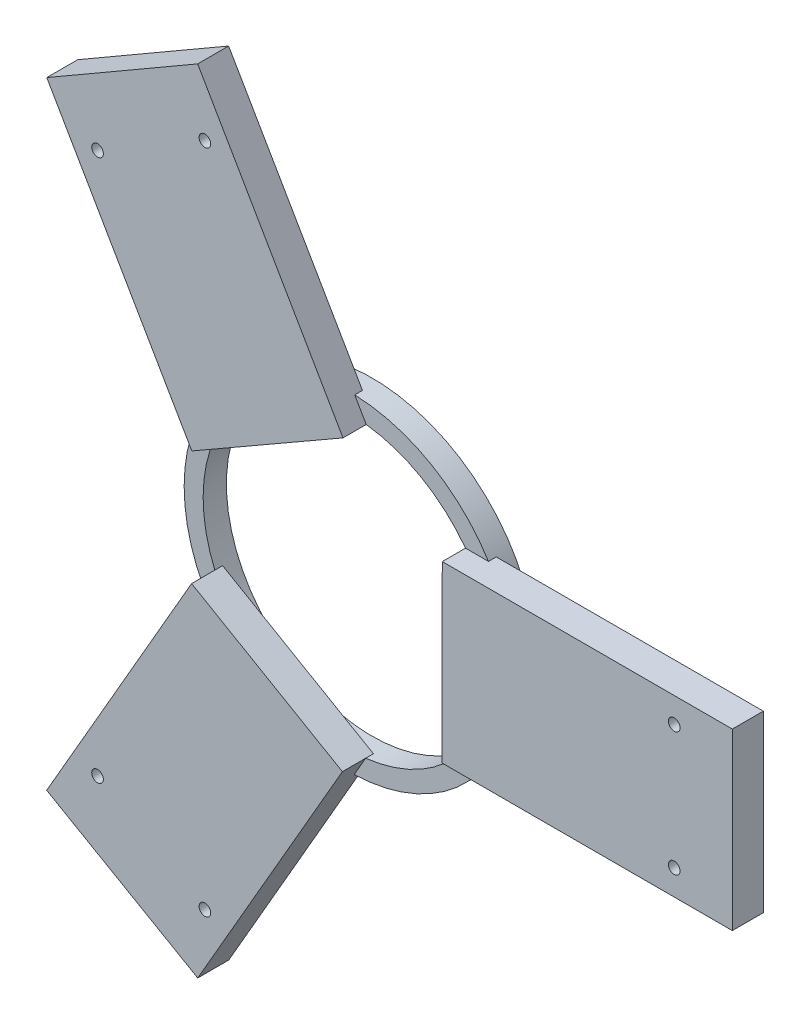
ISO-10303-21;
HEADER;
FILE_DESCRIPTION(('STEP AP214'),'2;1');
FILE_NAME('part.step','',(''),(''),'','','');
FILE_SCHEMA(('AUTOMOTIVE_DESIGN { 1 0 10303 214 1 1 1 1 }'));
ENDSEC;
DATA;
#1=APPLICATION_CONTEXT('core data for automotive mechanical design processes');
#2=APPLICATION_PROTOCOL_DEFINITION('international standard','automotive_design',2000,#1);
#3=PRODUCT_CONTEXT('',#1,'mechanical');
#4=PRODUCT('Part','Part','',(#3));
#5=PRODUCT_RELATED_PRODUCT_CATEGORY('part','',(#4));
#6=PRODUCT_DEFINITION_FORMATION('','',#4);
#7=PRODUCT_DEFINITION_CONTEXT('part definition',#1,'design');
#8=PRODUCT_DEFINITION('design','',#6,#7);
#9=PRODUCT_DEFINITION_SHAPE('','',#8);
#10=(LENGTH_UNIT() NAMED_UNIT(*) SI_UNIT(.MILLI.,.METRE.));
#11=(NAMED_UNIT(*) PLANE_ANGLE_UNIT() SI_UNIT($,.RADIAN.));
#12=(NAMED_UNIT(*) SI_UNIT($,.STERADIAN.) SOLID_ANGLE_UNIT());
#13=UNCERTAINTY_MEASURE_WITH_UNIT(LENGTH_MEASURE(1.E-05),#10,'distance_accuracy_value','');
#14=(GEOMETRIC_REPRESENTATION_CONTEXT(3) GLOBAL_UNCERTAINTY_ASSIGNED_CONTEXT((#13)) GLOBAL_UNIT_ASSIGNED_CONTEXT((#10,
#11,#12)) REPRESENTATION_CONTEXT('',''));
#15=CARTESIAN_POINT('',(0.,0.,0.));
#16=DIRECTION('',(0.,0.,1.));
#17=DIRECTION('',(1.,0.,0.));
#18=AXIS2_PLACEMENT_3D('',#15,#16,#17);
#19=CARTESIAN_POINT('',(300.,300.,12.));
#20=DIRECTION('',(0.,0.,-1.));
#21=DIRECTION('',(-1.,0.,0.));
#22=AXIS2_PLACEMENT_3D('',#19,#20,#21);
#23=CYLINDRICAL_SURFACE('',#22,85.);
#24=CARTESIAN_POINT('',(300.,300.,0.));
#25=DIRECTION('',(0.,0.,1.));
#26=DIRECTION('',(1.,0.,0.));
#27=AXIS2_PLACEMENT_3D('',#24,#25,#26);
#28=CIRCLE('',#27,85.);
#29=CARTESIAN_POINT('',(385.,300.,0.));
#30=VERTEX_POINT('',#29);
#31=EDGE_CURVE('E342',#30,#30,#28,.T.);
#32=ORIENTED_EDGE('',*,*,#31,.T.);
#33=EDGE_LOOP('',(#32));
#34=FACE_BOUND('',#33,.T.);
#35=DIRECTION('',(0.,0.,-1.));
#36=VECTOR('',#35,1.);
#37=CARTESIAN_POINT('',(224.91219391643,260.165073395874,12.));
#38=LINE('',#37,#36);
#39=CARTESIAN_POINT('',(224.91219391643,260.165073395874,12.));
#40=VERTEX_POINT('',#39);
#41=CARTESIAN_POINT('',(224.91219391643,260.165073395874,8.));
#42=VERTEX_POINT('',#41);
#43=EDGE_CURVE('E214',#40,#42,#38,.T.);
#44=ORIENTED_EDGE('',*,*,#43,.F.);
#45=CARTESIAN_POINT('',(300.,300.,12.));
#46=DIRECTION('',(0.,0.,1.));
#47=DIRECTION('',(1.,0.,0.));
#48=AXIS2_PLACEMENT_3D('',#45,#46,#47);
#49=CIRCLE('',#48,85.);
#50=CARTESIAN_POINT('',(225.034550566013,340.064715039051,12.));
#51=VERTEX_POINT('',#50);
#52=EDGE_CURVE('E339',#51,#40,#49,.T.);
#53=ORIENTED_EDGE('',*,*,#52,.F.);
#54=DIRECTION('',(0.,0.,-1.));
#55=VECTOR('',#54,1.);
#56=CARTESIAN_POINT('',(225.034550566013,340.064715039051,12.));
#57=LINE('',#56,#55);
#58=CARTESIAN_POINT('',(225.034550566013,340.064715039051,8.));
#59=VERTEX_POINT('',#58);
#60=EDGE_CURVE('E264',#59,#51,#57,.F.);
#61=ORIENTED_EDGE('',*,*,#60,.F.);
#62=CARTESIAN_POINT('',(300.,300.,8.));
#63=DIRECTION('',(0.,0.,1.));
#64=DIRECTION('',(1.,0.,0.));
#65=AXIS2_PLACEMENT_3D('',#62,#63,#64);
#66=CIRCLE('',#65,85.);
#67=CARTESIAN_POINT('',(303.045844644723,384.945410884875,8.));
#68=VERTEX_POINT('',#67);
#69=EDGE_CURVE('E257',#68,#59,#66,.T.);
#70=ORIENTED_EDGE('',*,*,#69,.F.);
#71=DIRECTION('',(0.,0.,-1.));
#72=VECTOR('',#71,1.);
#73=CARTESIAN_POINT('',(303.045844644723,384.945410884875,12.));
#74=LINE('',#73,#72);
#75=CARTESIAN_POINT('',(303.045844644723,384.945410884875,12.));
#76=VERTEX_POINT('',#75);
#77=EDGE_CURVE('E269',#76,#68,#74,.T.);
#78=ORIENTED_EDGE('',*,*,#77,.F.);
#79=CARTESIAN_POINT('',(372.11102550928,345.,12.));
#80=VERTEX_POINT('',#79);
#81=EDGE_CURVE('E336',#80,#76,#49,.T.);
#82=ORIENTED_EDGE('',*,*,#81,.F.);
#83=DIRECTION('',(0.,0.,-1.));
#84=VECTOR('',#83,1.);
#85=CARTESIAN_POINT('',(372.11102550928,345.,12.));
#86=LINE('',#85,#84);
#87=CARTESIAN_POINT('',(372.11102550928,345.,8.));
#88=VERTEX_POINT('',#87);
#89=EDGE_CURVE('E321',#88,#80,#86,.F.);
#90=ORIENTED_EDGE('',*,*,#89,.F.);
#91=CARTESIAN_POINT('',(300.,300.,8.));
#92=DIRECTION('',(0.,0.,1.));
#93=DIRECTION('',(1.,0.,0.));
#94=AXIS2_PLACEMENT_3D('',#91,#92,#93);
#95=CIRCLE('',#94,85.);
#96=CARTESIAN_POINT('',(372.036002110056,254.88,8.));
#97=VERTEX_POINT('',#96);
#98=EDGE_CURVE('E316',#97,#88,#95,.T.);
#99=ORIENTED_EDGE('',*,*,#98,.F.);
#100=DIRECTION('',(0.,0.,-1.));
#101=VECTOR('',#100,1.);
#102=CARTESIAN_POINT('',(372.036002110056,254.88,12.));
#103=LINE('',#102,#101);
#104=CARTESIAN_POINT('',(372.036002110056,254.88,12.));
#105=VERTEX_POINT('',#104);
#106=EDGE_CURVE('E330',#105,#97,#103,.T.);
#107=ORIENTED_EDGE('',*,*,#106,.F.);
#108=CARTESIAN_POINT('',(302.785663697791,215.045658864524,12.));
#109=VERTEX_POINT('',#108);
#110=EDGE_CURVE('E341',#109,#105,#49,.T.);
#111=ORIENTED_EDGE('',*,*,#110,.F.);
#112=DIRECTION('',(0.,0.,-1.));
#113=VECTOR('',#112,1.);
#114=CARTESIAN_POINT('',(302.785663697791,215.045658864524,12.));
#115=LINE('',#114,#113);
#116=CARTESIAN_POINT('',(302.785663697791,215.045658864524,8.));
#117=VERTEX_POINT('',#116);
#118=EDGE_CURVE('E52',#117,#109,#115,.F.);
#119=ORIENTED_EDGE('',*,*,#118,.F.);
#120=CARTESIAN_POINT('',(300.,300.,8.));
#121=DIRECTION('',(0.,0.,1.));
#122=DIRECTION('',(1.,0.,0.));
#123=AXIS2_PLACEMENT_3D('',#120,#121,#122);
#124=CIRCLE('',#123,85.);
#125=EDGE_CURVE('E60',#42,#117,#124,.T.);
#126=ORIENTED_EDGE('',*,*,#125,.F.);
#127=EDGE_LOOP('',(#44,#53,#61,#70,#78,#82,#90,#99,#107,#111,#119,#126));
#128=FACE_BOUND('',#127,.T.);
#129=ADVANCED_FACE('F39',(#34,#128),#23,.T.);
#130=CARTESIAN_POINT('',(300.,300.,12.));
#131=DIRECTION('',(0.,0.,1.));
#132=DIRECTION('',(1.,0.,0.));
#133=AXIS2_PLACEMENT_3D('',#130,#131,#132);
#134=PLANE('',#133);
#135=ORIENTED_EDGE('',*,*,#52,.T.);
#136=DIRECTION('',(0.499306279760121,0.866425553058142,0.));
#137=VECTOR('',#136,1.);
#138=CARTESIAN_POINT('',(260.865147740129,322.552748383134,12.));
#139=LINE('',#138,#137);
#140=CARTESIAN_POINT('',(230.844933781246,270.459911708328,12.));
#141=VERTEX_POINT('',#140);
#142=EDGE_CURVE('E213',#40,#141,#139,.T.);
#143=ORIENTED_EDGE('',*,*,#142,.T.);
#144=CARTESIAN_POINT('',(300.,300.,12.));
#145=DIRECTION('',(0.,0.,1.));
#146=DIRECTION('',(1.,0.,0.));
#147=AXIS2_PLACEMENT_3D('',#144,#145,#146);
#148=CIRCLE('',#147,75.2);
#149=CARTESIAN_POINT('',(230.963081874477,329.815162849293,12.));
#150=VERTEX_POINT('',#149);
#151=EDGE_CURVE('E333',#150,#141,#148,.T.);
#152=ORIENTED_EDGE('',*,*,#151,.F.);
#153=DIRECTION('',(-0.500693399556272,0.865624699070436,0.));
#154=VECTOR('',#153,1.);
#155=CARTESIAN_POINT('',(261.192481221797,277.553010529542,12.));
#156=LINE('',#155,#154);
#157=EDGE_CURVE('E263',#150,#51,#156,.T.);
#158=ORIENTED_EDGE('',*,*,#157,.T.);
#159=EDGE_LOOP('',(#135,#143,#152,#158));
#160=FACE_BOUND('',#159,.T.);
#161=ADVANCED_FACE('F435',(#160),#134,.T.);
#162=CARTESIAN_POINT('',(308.697770617303,225.304693679664,12.));
#163=VERTEX_POINT('',#162);
#164=CARTESIAN_POINT('',(360.16,254.88,12.));
#165=VERTEX_POINT('',#164);
#166=EDGE_CURVE('E329',#163,#165,#148,.T.);
#167=ORIENTED_EDGE('',*,*,#166,.F.);
#168=DIRECTION('',(-0.499306279760121,-0.866425553058142,0.));
#169=VECTOR('',#168,1.);
#170=CARTESIAN_POINT('',(338.843422508999,277.615197615464,12.));
#171=LINE('',#170,#169);
#172=EDGE_CURVE('E202',#163,#109,#171,.T.);
#173=ORIENTED_EDGE('',*,*,#172,.T.);
#174=ORIENTED_EDGE('',*,*,#110,.T.);
#175=DIRECTION('',(-1.,0.,0.));
#176=VECTOR('',#175,1.);
#177=CARTESIAN_POINT('',(300.,254.88,12.));
#178=LINE('',#177,#176);
#179=EDGE_CURVE('E322',#105,#165,#178,.T.);
#180=ORIENTED_EDGE('',*,*,#179,.T.);
#181=EDGE_LOOP('',(#167,#173,#174,#180));
#182=FACE_BOUND('',#181,.T.);
#183=ADVANCED_FACE('F437',(#182),#134,.T.);
#184=CARTESIAN_POINT('',(300.,300.,-20.));
#185=DIRECTION('',(0.,0.,1.));
#186=DIRECTION('',(1.,0.,0.));
#187=AXIS2_PLACEMENT_3D('',#184,#185,#186);
#188=CYLINDRICAL_SURFACE('',#187,75.2);
#189=CARTESIAN_POINT('',(300.,300.,0.));
#190=DIRECTION('',(0.,0.,1.));
#191=DIRECTION('',(1.,0.,0.));
#192=AXIS2_PLACEMENT_3D('',#189,#190,#191);
#193=CIRCLE('',#192,75.2);
#194=CARTESIAN_POINT('',(375.2,300.,0.));
#195=VERTEX_POINT('',#194);
#196=EDGE_CURVE('E331',#195,#195,#193,.T.);
#197=ORIENTED_EDGE('',*,*,#196,.F.);
#198=EDGE_LOOP('',(#197));
#199=FACE_BOUND('',#198,.T.);
#200=DIRECTION('',(0.,0.,1.));
#201=VECTOR('',#200,1.);
#202=CARTESIAN_POINT('',(230.844933781246,270.459911708328,-20.));
#203=LINE('',#202,#201);
#204=CARTESIAN_POINT('',(230.844933781246,270.459911708328,8.));
#205=VERTEX_POINT('',#204);
#206=EDGE_CURVE('E11',#205,#141,#203,.T.);
#207=ORIENTED_EDGE('',*,*,#206,.F.);
#208=CARTESIAN_POINT('',(300.,300.,8.));
#209=DIRECTION('',(0.,0.,1.));
#210=DIRECTION('',(1.,0.,0.));
#211=AXIS2_PLACEMENT_3D('',#208,#209,#210);
#212=CIRCLE('',#211,75.2);
#213=CARTESIAN_POINT('',(308.697770617303,225.304693679664,8.));
#214=VERTEX_POINT('',#213);
#215=EDGE_CURVE('E365',#214,#205,#212,.F.);
#216=ORIENTED_EDGE('',*,*,#215,.F.);
#217=DIRECTION('',(0.,0.,1.));
#218=VECTOR('',#217,1.);
#219=CARTESIAN_POINT('',(308.697770617303,225.304693679664,-20.));
#220=LINE('',#219,#218);
#221=EDGE_CURVE('E46',#163,#214,#220,.F.);
#222=ORIENTED_EDGE('',*,*,#221,.F.);
#223=ORIENTED_EDGE('',*,*,#166,.T.);
#224=DIRECTION('',(0.,0.,1.));
#225=VECTOR('',#224,1.);
#226=CARTESIAN_POINT('',(360.16,254.88,-20.));
#227=LINE('',#226,#225);
#228=CARTESIAN_POINT('',(360.16,254.88,8.));
#229=VERTEX_POINT('',#228);
#230=EDGE_CURVE('E355',#229,#165,#227,.T.);
#231=ORIENTED_EDGE('',*,*,#230,.F.);
#232=CARTESIAN_POINT('',(300.,300.,8.));
#233=DIRECTION('',(0.,0.,1.));
#234=DIRECTION('',(1.,0.,0.));
#235=AXIS2_PLACEMENT_3D('',#232,#233,#234);
#236=CIRCLE('',#235,75.2);
#237=CARTESIAN_POINT('',(360.249813277719,345.,8.));
#238=VERTEX_POINT('',#237);
#239=EDGE_CURVE('E338',#238,#229,#236,.F.);
#240=ORIENTED_EDGE('',*,*,#239,.F.);
#241=DIRECTION('',(0.,0.,1.));
#242=VECTOR('',#241,1.);
#243=CARTESIAN_POINT('',(360.249813277719,345.,-20.));
#244=LINE('',#243,#242);
#245=CARTESIAN_POINT('',(360.249813277719,345.,12.));
#246=VERTEX_POINT('',#245);
#247=EDGE_CURVE('E349',#246,#238,#244,.F.);
#248=ORIENTED_EDGE('',*,*,#247,.F.);
#249=CARTESIAN_POINT('',(308.995066218754,374.660088291672,12.));
#250=VERTEX_POINT('',#249);
#251=EDGE_CURVE('E332',#246,#250,#148,.T.);
#252=ORIENTED_EDGE('',*,*,#251,.T.);
#253=DIRECTION('',(0.,0.,1.));
#254=VECTOR('',#253,1.);
#255=CARTESIAN_POINT('',(308.995066218754,374.660088291672,-20.));
#256=LINE('',#255,#254);
#257=CARTESIAN_POINT('',(308.995066218754,374.660088291672,8.));
#258=VERTEX_POINT('',#257);
#259=EDGE_CURVE('E363',#258,#250,#256,.T.);
#260=ORIENTED_EDGE('',*,*,#259,.F.);
#261=CARTESIAN_POINT('',(300.,300.,8.));
#262=DIRECTION('',(0.,0.,1.));
#263=DIRECTION('',(1.,0.,0.));
#264=AXIS2_PLACEMENT_3D('',#261,#262,#263);
#265=CIRCLE('',#264,75.2);
#266=CARTESIAN_POINT('',(230.963081874477,329.815162849293,8.));
#267=VERTEX_POINT('',#266);
#268=EDGE_CURVE('E354',#267,#258,#265,.F.);
#269=ORIENTED_EDGE('',*,*,#268,.F.);
#270=DIRECTION('',(0.,0.,1.));
#271=VECTOR('',#270,1.);
#272=CARTESIAN_POINT('',(230.963081874477,329.815162849293,-20.));
#273=LINE('',#272,#271);
#274=EDGE_CURVE('E359',#150,#267,#273,.F.);
#275=ORIENTED_EDGE('',*,*,#274,.F.);
#276=ORIENTED_EDGE('',*,*,#151,.T.);
#277=EDGE_LOOP('',(#207,#216,#222,#223,#231,#240,#248,#252,#260,#269,#275,#276));
#278=FACE_BOUND('',#277,.T.);
#279=ADVANCED_FACE('F461',(#199,#278),#188,.F.);
#280=ORIENTED_EDGE('',*,*,#81,.T.);
#281=DIRECTION('',(0.500693399556272,-0.865624699070436,0.));
#282=VECTOR('',#281,1.);
#283=CARTESIAN_POINT('',(339.098679154888,322.615402038832,12.));
#284=LINE('',#283,#282);
#285=EDGE_CURVE('E268',#76,#250,#284,.T.);
#286=ORIENTED_EDGE('',*,*,#285,.T.);
#287=ORIENTED_EDGE('',*,*,#251,.F.);
#288=DIRECTION('',(1.,0.,0.));
#289=VECTOR('',#288,1.);
#290=CARTESIAN_POINT('',(300.,345.,12.));
#291=LINE('',#290,#289);
#292=EDGE_CURVE('E317',#246,#80,#291,.T.);
#293=ORIENTED_EDGE('',*,*,#292,.T.);
#294=EDGE_LOOP('',(#280,#286,#287,#293));
#295=FACE_BOUND('',#294,.T.);
#296=ADVANCED_FACE('F442',(#295),#134,.T.);
#297=CARTESIAN_POINT('',(300.,300.,0.));
#298=DIRECTION('',(0.,0.,1.));
#299=DIRECTION('',(1.,0.,0.));
#300=AXIS2_PLACEMENT_3D('',#297,#298,#299);
#301=PLANE('',#300);
#302=ORIENTED_EDGE('',*,*,#196,.T.);
#303=EDGE_LOOP('',(#302));
#304=FACE_BOUND('',#303,.T.);
#305=ORIENTED_EDGE('',*,*,#31,.F.);
#306=EDGE_LOOP('',(#305));
#307=FACE_BOUND('',#306,.T.);
#308=ADVANCED_FACE('F486',(#304,#307),#301,.F.);
#309=CARTESIAN_POINT('',(360.16,254.88,24.));
#310=DIRECTION('',(0.,1.,0.));
#311=DIRECTION('',(0.,0.,1.));
#312=AXIS2_PLACEMENT_3D('',#309,#310,#311);
#313=PLANE('',#312);
#314=ORIENTED_EDGE('',*,*,#179,.F.);
#315=ORIENTED_EDGE('',*,*,#106,.T.);
#316=DIRECTION('',(1.,0.,0.));
#317=VECTOR('',#316,1.);
#318=CARTESIAN_POINT('',(360.16,254.88,8.));
#319=LINE('',#318,#317);
#320=CARTESIAN_POINT('',(510.,254.88,8.));
#321=VERTEX_POINT('',#320);
#322=EDGE_CURVE('E298',#97,#321,#319,.T.);
#323=ORIENTED_EDGE('',*,*,#322,.T.);
#324=DIRECTION('',(0.,0.,-1.));
#325=VECTOR('',#324,1.);
#326=CARTESIAN_POINT('',(510.,254.88,24.));
#327=LINE('',#326,#325);
#328=CARTESIAN_POINT('',(510.,254.88,24.));
#329=VERTEX_POINT('',#328);
#330=EDGE_CURVE('E309',#329,#321,#327,.T.);
#331=ORIENTED_EDGE('',*,*,#330,.F.);
#332=DIRECTION('',(1.,0.,0.));
#333=VECTOR('',#332,1.);
#334=CARTESIAN_POINT('',(360.16,254.88,24.));
#335=LINE('',#334,#333);
#336=CARTESIAN_POINT('',(360.16,254.88,24.));
#337=VERTEX_POINT('',#336);
#338=EDGE_CURVE('E288',#337,#329,#335,.T.);
#339=ORIENTED_EDGE('',*,*,#338,.F.);
#340=DIRECTION('',(0.,0.,-1.));
#341=VECTOR('',#340,1.);
#342=CARTESIAN_POINT('',(360.16,254.88,24.));
#343=LINE('',#342,#341);
#344=EDGE_CURVE('E311',#337,#165,#343,.T.);
#345=ORIENTED_EDGE('',*,*,#344,.T.);
#346=EDGE_LOOP('',(#314,#315,#323,#331,#339,#345));
#347=FACE_BOUND('',#346,.T.);
#348=ADVANCED_FACE('F453',(#347),#313,.F.);
#349=CARTESIAN_POINT('',(510.,345.,24.));
#350=DIRECTION('',(0.,-1.,0.));
#351=DIRECTION('',(0.,0.,-1.));
#352=AXIS2_PLACEMENT_3D('',#349,#350,#351);
#353=PLANE('',#352);
#354=DIRECTION('',(-1.,0.,0.));
#355=VECTOR('',#354,1.);
#356=CARTESIAN_POINT('',(510.,345.,8.));
#357=LINE('',#356,#355);
#358=CARTESIAN_POINT('',(510.,345.,8.));
#359=VERTEX_POINT('',#358);
#360=EDGE_CURVE('E290',#359,#88,#357,.T.);
#361=ORIENTED_EDGE('',*,*,#360,.T.);
#362=ORIENTED_EDGE('',*,*,#89,.T.);
#363=ORIENTED_EDGE('',*,*,#292,.F.);
#364=DIRECTION('',(0.,0.,-1.));
#365=VECTOR('',#364,1.);
#366=CARTESIAN_POINT('',(360.249813277719,345.,24.));
#367=LINE('',#366,#365);
#368=CARTESIAN_POINT('',(360.249813277719,345.,24.));
#369=VERTEX_POINT('',#368);
#370=EDGE_CURVE('E296',#369,#246,#367,.T.);
#371=ORIENTED_EDGE('',*,*,#370,.F.);
#372=DIRECTION('',(-1.,0.,0.));
#373=VECTOR('',#372,1.);
#374=CARTESIAN_POINT('',(510.,345.,24.));
#375=LINE('',#374,#373);
#376=CARTESIAN_POINT('',(510.,345.,24.));
#377=VERTEX_POINT('',#376);
#378=EDGE_CURVE('E294',#377,#369,#375,.T.);
#379=ORIENTED_EDGE('',*,*,#378,.F.);
#380=DIRECTION('',(0.,0.,-1.));
#381=VECTOR('',#380,1.);
#382=CARTESIAN_POINT('',(510.,345.,24.));
#383=LINE('',#382,#381);
#384=EDGE_CURVE('E307',#377,#359,#383,.T.);
#385=ORIENTED_EDGE('',*,*,#384,.T.);
#386=EDGE_LOOP('',(#361,#362,#363,#371,#379,#385));
#387=FACE_BOUND('',#386,.T.);
#388=ADVANCED_FACE('F475',(#387),#353,.F.);
#389=CARTESIAN_POINT('',(0.,0.,8.));
#390=DIRECTION('',(0.,0.,1.));
#391=DIRECTION('',(1.,0.,0.));
#392=AXIS2_PLACEMENT_3D('',#389,#390,#391);
#393=PLANE('',#392);
#394=CARTESIAN_POINT('',(480.,332.,8.));
#395=DIRECTION('',(0.,0.,1.));
#396=DIRECTION('',(1.,0.,0.));
#397=AXIS2_PLACEMENT_3D('',#394,#395,#396);
#398=CIRCLE('',#397,2.99999999999999);
#399=CARTESIAN_POINT('',(483.,332.,8.));
#400=VERTEX_POINT('',#399);
#401=EDGE_CURVE('E277',#400,#400,#398,.T.);
#402=ORIENTED_EDGE('',*,*,#401,.T.);
#403=EDGE_LOOP('',(#402));
#404=FACE_BOUND('',#403,.T.);
#405=CARTESIAN_POINT('',(480.,268.,8.));
#406=DIRECTION('',(0.,0.,1.));
#407=DIRECTION('',(1.,0.,0.));
#408=AXIS2_PLACEMENT_3D('',#405,#406,#407);
#409=CIRCLE('',#408,2.99999999999999);
#410=CARTESIAN_POINT('',(483.,268.,8.));
#411=VERTEX_POINT('',#410);
#412=EDGE_CURVE('E285',#411,#411,#409,.T.);
#413=ORIENTED_EDGE('',*,*,#412,.T.);
#414=EDGE_LOOP('',(#413));
#415=FACE_BOUND('',#414,.T.);
#416=ORIENTED_EDGE('',*,*,#322,.F.);
#417=ORIENTED_EDGE('',*,*,#98,.T.);
#418=ORIENTED_EDGE('',*,*,#360,.F.);
#419=DIRECTION('',(0.,1.,0.));
#420=VECTOR('',#419,1.);
#421=CARTESIAN_POINT('',(510.,254.88,8.));
#422=LINE('',#421,#420);
#423=EDGE_CURVE('E301',#321,#359,#422,.T.);
#424=ORIENTED_EDGE('',*,*,#423,.F.);
#425=EDGE_LOOP('',(#416,#417,#418,#424));
#426=FACE_BOUND('',#425,.T.);
#427=ADVANCED_FACE('F464',(#404,#415,#426),#393,.F.);
#428=DIRECTION('',(-0.000996596017726428,-0.999999503398066,0.));
#429=VECTOR('',#428,1.);
#430=CARTESIAN_POINT('',(360.249813277719,345.,8.));
#431=LINE('',#430,#429);
#432=EDGE_CURVE('E284',#238,#229,#431,.T.);
#433=ORIENTED_EDGE('',*,*,#432,.F.);
#434=ORIENTED_EDGE('',*,*,#239,.T.);
#435=EDGE_LOOP('',(#433,#434));
#436=FACE_BOUND('',#435,.T.);
#437=ADVANCED_FACE('F462',(#436),#393,.F.);
#438=CARTESIAN_POINT('',(360.249813277719,345.,24.));
#439=DIRECTION('',(0.999999503398065,-0.000996596017726427,0.));
#440=DIRECTION('',(0.000996596017726428,0.999999503398066,0.));
#441=AXIS2_PLACEMENT_3D('',#438,#439,#440);
#442=PLANE('',#441);
#443=ORIENTED_EDGE('',*,*,#432,.T.);
#444=ORIENTED_EDGE('',*,*,#230,.T.);
#445=ORIENTED_EDGE('',*,*,#344,.F.);
#446=DIRECTION('',(-0.000996596017726428,-0.999999503398066,0.));
#447=VECTOR('',#446,1.);
#448=CARTESIAN_POINT('',(360.249813277719,345.,24.));
#449=LINE('',#448,#447);
#450=EDGE_CURVE('E286',#369,#337,#449,.T.);
#451=ORIENTED_EDGE('',*,*,#450,.F.);
#452=ORIENTED_EDGE('',*,*,#370,.T.);
#453=ORIENTED_EDGE('',*,*,#247,.T.);
#454=EDGE_LOOP('',(#443,#444,#445,#451,#452,#453));
#455=FACE_BOUND('',#454,.T.);
#456=ADVANCED_FACE('F459',(#455),#442,.F.);
#457=CARTESIAN_POINT('',(510.,254.88,24.));
#458=DIRECTION('',(-1.,0.,0.));
#459=DIRECTION('',(0.,0.,1.));
#460=AXIS2_PLACEMENT_3D('',#457,#458,#459);
#461=PLANE('',#460);
#462=ORIENTED_EDGE('',*,*,#423,.T.);
#463=ORIENTED_EDGE('',*,*,#384,.F.);
#464=DIRECTION('',(0.,1.,0.));
#465=VECTOR('',#464,1.);
#466=CARTESIAN_POINT('',(510.,254.88,24.));
#467=LINE('',#466,#465);
#468=EDGE_CURVE('E295',#329,#377,#467,.T.);
#469=ORIENTED_EDGE('',*,*,#468,.F.);
#470=ORIENTED_EDGE('',*,*,#330,.T.);
#471=EDGE_LOOP('',(#462,#463,#469,#470));
#472=FACE_BOUND('',#471,.T.);
#473=ADVANCED_FACE('F473',(#472),#461,.F.);
#474=CARTESIAN_POINT('',(0.,0.,24.));
#475=DIRECTION('',(0.,0.,1.));
#476=DIRECTION('',(1.,0.,0.));
#477=AXIS2_PLACEMENT_3D('',#474,#475,#476);
#478=PLANE('',#477);
#479=CARTESIAN_POINT('',(480.,332.,24.));
#480=DIRECTION('',(0.,0.,1.));
#481=DIRECTION('',(1.,0.,0.));
#482=AXIS2_PLACEMENT_3D('',#479,#480,#481);
#483=CIRCLE('',#482,2.99999999999999);
#484=CARTESIAN_POINT('',(483.,332.,24.));
#485=VERTEX_POINT('',#484);
#486=EDGE_CURVE('E272',#485,#485,#483,.T.);
#487=ORIENTED_EDGE('',*,*,#486,.F.);
#488=EDGE_LOOP('',(#487));
#489=FACE_BOUND('',#488,.T.);
#490=CARTESIAN_POINT('',(480.,268.,24.));
#491=DIRECTION('',(0.,0.,1.));
#492=DIRECTION('',(1.,0.,0.));
#493=AXIS2_PLACEMENT_3D('',#490,#491,#492);
#494=CIRCLE('',#493,2.99999999999999);
#495=CARTESIAN_POINT('',(483.,268.,24.));
#496=VERTEX_POINT('',#495);
#497=EDGE_CURVE('E276',#496,#496,#494,.T.);
#498=ORIENTED_EDGE('',*,*,#497,.F.);
#499=EDGE_LOOP('',(#498));
#500=FACE_BOUND('',#499,.T.);
#501=ORIENTED_EDGE('',*,*,#450,.T.);
#502=ORIENTED_EDGE('',*,*,#338,.T.);
#503=ORIENTED_EDGE('',*,*,#468,.T.);
#504=ORIENTED_EDGE('',*,*,#378,.T.);
#505=EDGE_LOOP('',(#501,#502,#503,#504));
#506=FACE_BOUND('',#505,.T.);
#507=ADVANCED_FACE('F476',(#489,#500,#506),#478,.T.);
#508=CARTESIAN_POINT('',(480.,268.,-20.));
#509=DIRECTION('',(0.,0.,1.));
#510=DIRECTION('',(1.,0.,0.));
#511=AXIS2_PLACEMENT_3D('',#508,#509,#510);
#512=CYLINDRICAL_SURFACE('',#511,2.99999999999999);
#513=ORIENTED_EDGE('',*,*,#497,.T.);
#514=EDGE_LOOP('',(#513));
#515=FACE_BOUND('',#514,.T.);
#516=ORIENTED_EDGE('',*,*,#412,.F.);
#517=EDGE_LOOP('',(#516));
#518=FACE_BOUND('',#517,.T.);
#519=ADVANCED_FACE('F541',(#515,#518),#512,.F.);
#520=CARTESIAN_POINT('',(480.,332.,-20.));
#521=DIRECTION('',(0.,0.,1.));
#522=DIRECTION('',(1.,0.,0.));
#523=AXIS2_PLACEMENT_3D('',#520,#521,#522);
#524=CYLINDRICAL_SURFACE('',#523,2.99999999999999);
#525=ORIENTED_EDGE('',*,*,#486,.T.);
#526=EDGE_LOOP('',(#525));
#527=FACE_BOUND('',#526,.T.);
#528=ORIENTED_EDGE('',*,*,#401,.F.);
#529=EDGE_LOOP('',(#528));
#530=FACE_BOUND('',#529,.T.);
#531=ADVANCED_FACE('F549',(#527,#530),#524,.F.);
#532=CARTESIAN_POINT('',(308.995066218754,374.660088291672,24.));
#533=DIRECTION('',(-0.865624699070436,-0.500693399556272,0.));
#534=DIRECTION('',(0.500693399556272,-0.865624699070436,0.));
#535=AXIS2_PLACEMENT_3D('',#532,#533,#534);
#536=PLANE('',#535);
#537=ORIENTED_EDGE('',*,*,#285,.F.);
#538=ORIENTED_EDGE('',*,*,#77,.T.);
#539=DIRECTION('',(-0.500693399556272,0.865624699070436,0.));
#540=VECTOR('',#539,1.);
#541=CARTESIAN_POINT('',(308.995066218754,374.660088291672,8.));
#542=LINE('',#541,#540);
#543=CARTESIAN_POINT('',(233.9711431703,504.365334794732,8.));
#544=VERTEX_POINT('',#543);
#545=EDGE_CURVE('E242',#68,#544,#542,.T.);
#546=ORIENTED_EDGE('',*,*,#545,.T.);
#547=DIRECTION('',(0.,0.,-1.));
#548=VECTOR('',#547,1.);
#549=CARTESIAN_POINT('',(233.9711431703,504.365334794732,24.));
#550=LINE('',#549,#548);
#551=CARTESIAN_POINT('',(233.9711431703,504.365334794732,24.));
#552=VERTEX_POINT('',#551);
#553=EDGE_CURVE('E255',#552,#544,#550,.T.);
#554=ORIENTED_EDGE('',*,*,#553,.F.);
#555=DIRECTION('',(-0.500693399556272,0.865624699070436,0.));
#556=VECTOR('',#555,1.);
#557=CARTESIAN_POINT('',(308.995066218754,374.660088291672,24.));
#558=LINE('',#557,#556);
#559=CARTESIAN_POINT('',(308.995066218754,374.660088291672,24.));
#560=VERTEX_POINT('',#559);
#561=EDGE_CURVE('E234',#560,#552,#558,.T.);
#562=ORIENTED_EDGE('',*,*,#561,.F.);
#563=DIRECTION('',(0.,0.,-1.));
#564=VECTOR('',#563,1.);
#565=CARTESIAN_POINT('',(308.995066218754,374.660088291672,24.));
#566=LINE('',#565,#564);
#567=EDGE_CURVE('E260',#560,#250,#566,.T.);
#568=ORIENTED_EDGE('',*,*,#567,.T.);
#569=EDGE_LOOP('',(#537,#538,#546,#554,#562,#568));
#570=FACE_BOUND('',#569,.T.);
#571=ADVANCED_FACE('F557',(#570),#536,.F.);
#572=CARTESIAN_POINT('',(156.064945237209,459.302943285442,24.));
#573=DIRECTION('',(0.865624699070436,0.500693399556272,0.));
#574=DIRECTION('',(-0.500693399556272,0.865624699070436,0.));
#575=AXIS2_PLACEMENT_3D('',#572,#573,#574);
#576=PLANE('',#575);
#577=DIRECTION('',(0.500693399556272,-0.865624699070436,0.));
#578=VECTOR('',#577,1.);
#579=CARTESIAN_POINT('',(156.064945237209,459.302943285442,8.));
#580=LINE('',#579,#578);
#581=CARTESIAN_POINT('',(156.064945237209,459.302943285442,8.));
#582=VERTEX_POINT('',#581);
#583=EDGE_CURVE('E233',#582,#59,#580,.T.);
#584=ORIENTED_EDGE('',*,*,#583,.T.);
#585=ORIENTED_EDGE('',*,*,#60,.T.);
#586=ORIENTED_EDGE('',*,*,#157,.F.);
#587=DIRECTION('',(0.,0.,-1.));
#588=VECTOR('',#587,1.);
#589=CARTESIAN_POINT('',(230.963081874477,329.815162849293,24.));
#590=LINE('',#589,#588);
#591=CARTESIAN_POINT('',(230.963081874477,329.815162849293,24.));
#592=VERTEX_POINT('',#591);
#593=EDGE_CURVE('E238',#592,#150,#590,.T.);
#594=ORIENTED_EDGE('',*,*,#593,.F.);
#595=DIRECTION('',(0.500693399556272,-0.865624699070436,0.));
#596=VECTOR('',#595,1.);
#597=CARTESIAN_POINT('',(156.064945237209,459.302943285442,24.));
#598=LINE('',#597,#596);
#599=CARTESIAN_POINT('',(156.064945237209,459.302943285442,24.));
#600=VERTEX_POINT('',#599);
#601=EDGE_CURVE('E236',#600,#592,#598,.T.);
#602=ORIENTED_EDGE('',*,*,#601,.F.);
#603=DIRECTION('',(0.,0.,-1.));
#604=VECTOR('',#603,1.);
#605=CARTESIAN_POINT('',(156.064945237209,459.302943285442,24.));
#606=LINE('',#605,#604);
#607=EDGE_CURVE('E253',#600,#582,#606,.T.);
#608=ORIENTED_EDGE('',*,*,#607,.T.);
#609=EDGE_LOOP('',(#584,#585,#586,#594,#602,#608));
#610=FACE_BOUND('',#609,.T.);
#611=ADVANCED_FACE('F573',(#610),#576,.F.);
#612=CARTESIAN_POINT('',(0.,0.,8.));
#613=DIRECTION('',(0.,0.,1.));
#614=DIRECTION('',(1.,0.,0.));
#615=AXIS2_PLACEMENT_3D('',#612,#613,#614);
#616=PLANE('',#615);
#617=CARTESIAN_POINT('',(182.287187078898,439.884572681199,8.));
#618=DIRECTION('',(0.,0.,1.));
#619=DIRECTION('',(1.,0.,0.));
#620=AXIS2_PLACEMENT_3D('',#617,#618,#619);
#621=CIRCLE('',#620,2.99999999999999);
#622=CARTESIAN_POINT('',(185.287187078898,439.884572681199,8.));
#623=VERTEX_POINT('',#622);
#624=EDGE_CURVE('E219',#623,#623,#621,.T.);
#625=ORIENTED_EDGE('',*,*,#624,.T.);
#626=EDGE_LOOP('',(#625));
#627=FACE_BOUND('',#626,.T.);
#628=CARTESIAN_POINT('',(237.712812921102,471.884572681199,8.));
#629=DIRECTION('',(0.,0.,1.));
#630=DIRECTION('',(1.,0.,0.));
#631=AXIS2_PLACEMENT_3D('',#628,#629,#630);
#632=CIRCLE('',#631,2.99999999999999);
#633=CARTESIAN_POINT('',(240.712812921102,471.884572681199,8.));
#634=VERTEX_POINT('',#633);
#635=EDGE_CURVE('E226',#634,#634,#632,.T.);
#636=ORIENTED_EDGE('',*,*,#635,.T.);
#637=EDGE_LOOP('',(#636));
#638=FACE_BOUND('',#637,.T.);
#639=ORIENTED_EDGE('',*,*,#545,.F.);
#640=ORIENTED_EDGE('',*,*,#69,.T.);
#641=ORIENTED_EDGE('',*,*,#583,.F.);
#642=DIRECTION('',(-0.865624699070436,-0.500693399556272,0.));
#643=VECTOR('',#642,1.);
#644=CARTESIAN_POINT('',(233.9711431703,504.365334794732,8.));
#645=LINE('',#644,#643);
#646=EDGE_CURVE('E244',#544,#582,#645,.T.);
#647=ORIENTED_EDGE('',*,*,#646,.F.);
#648=EDGE_LOOP('',(#639,#640,#641,#647));
#649=FACE_BOUND('',#648,.T.);
#650=ADVANCED_FACE('F585',(#627,#638,#649),#616,.F.);
#651=DIRECTION('',(0.86701894848784,0.498275167917328,0.));
#652=VECTOR('',#651,1.);
#653=CARTESIAN_POINT('',(230.963081874477,329.815162849293,8.));
#654=LINE('',#653,#652);
#655=EDGE_CURVE('E228',#267,#258,#654,.T.);
#656=ORIENTED_EDGE('',*,*,#655,.F.);
#657=ORIENTED_EDGE('',*,*,#268,.T.);
#658=EDGE_LOOP('',(#656,#657));
#659=FACE_BOUND('',#658,.T.);
#660=ADVANCED_FACE('F594',(#659),#616,.F.);
#661=CARTESIAN_POINT('',(230.963081874477,329.815162849293,24.));
#662=DIRECTION('',(-0.498275167917328,0.86701894848784,0.));
#663=DIRECTION('',(-0.86701894848784,-0.498275167917328,0.));
#664=AXIS2_PLACEMENT_3D('',#661,#662,#663);
#665=PLANE('',#664);
#666=ORIENTED_EDGE('',*,*,#655,.T.);
#667=ORIENTED_EDGE('',*,*,#259,.T.);
#668=ORIENTED_EDGE('',*,*,#567,.F.);
#669=DIRECTION('',(0.86701894848784,0.498275167917328,0.));
#670=VECTOR('',#669,1.);
#671=CARTESIAN_POINT('',(230.963081874477,329.815162849293,24.));
#672=LINE('',#671,#670);
#673=EDGE_CURVE('E229',#592,#560,#672,.T.);
#674=ORIENTED_EDGE('',*,*,#673,.F.);
#675=ORIENTED_EDGE('',*,*,#593,.T.);
#676=ORIENTED_EDGE('',*,*,#274,.T.);
#677=EDGE_LOOP('',(#666,#667,#668,#674,#675,#676));
#678=FACE_BOUND('',#677,.T.);
#679=ADVANCED_FACE('F607',(#678),#665,.F.);
#680=CARTESIAN_POINT('',(233.9711431703,504.365334794732,24.));
#681=DIRECTION('',(0.500693399556272,-0.865624699070436,0.));
#682=DIRECTION('',(0.865624699070436,0.500693399556272,0.));
#683=AXIS2_PLACEMENT_3D('',#680,#681,#682);
#684=PLANE('',#683);
#685=ORIENTED_EDGE('',*,*,#646,.T.);
#686=ORIENTED_EDGE('',*,*,#607,.F.);
#687=DIRECTION('',(-0.865624699070436,-0.500693399556272,0.));
#688=VECTOR('',#687,1.);
#689=CARTESIAN_POINT('',(233.9711431703,504.365334794732,24.));
#690=LINE('',#689,#688);
#691=EDGE_CURVE('E237',#552,#600,#690,.T.);
#692=ORIENTED_EDGE('',*,*,#691,.F.);
#693=ORIENTED_EDGE('',*,*,#553,.T.);
#694=EDGE_LOOP('',(#685,#686,#692,#693));
#695=FACE_BOUND('',#694,.T.);
#696=ADVANCED_FACE('F614',(#695),#684,.F.);
#697=CARTESIAN_POINT('',(0.,0.,24.));
#698=DIRECTION('',(0.,0.,1.));
#699=DIRECTION('',(1.,0.,0.));
#700=AXIS2_PLACEMENT_3D('',#697,#698,#699);
#701=PLANE('',#700);
#702=CARTESIAN_POINT('',(182.287187078898,439.884572681199,24.));
#703=DIRECTION('',(0.,0.,1.));
#704=DIRECTION('',(1.,0.,0.));
#705=AXIS2_PLACEMENT_3D('',#702,#703,#704);
#706=CIRCLE('',#705,2.99999999999999);
#707=CARTESIAN_POINT('',(185.287187078898,439.884572681199,24.));
#708=VERTEX_POINT('',#707);
#709=EDGE_CURVE('E220',#708,#708,#706,.T.);
#710=ORIENTED_EDGE('',*,*,#709,.F.);
#711=EDGE_LOOP('',(#710));
#712=FACE_BOUND('',#711,.T.);
#713=CARTESIAN_POINT('',(237.712812921102,471.884572681199,24.));
#714=DIRECTION('',(0.,0.,1.));
#715=DIRECTION('',(1.,0.,0.));
#716=AXIS2_PLACEMENT_3D('',#713,#714,#715);
#717=CIRCLE('',#716,2.99999999999999);
#718=CARTESIAN_POINT('',(240.712812921102,471.884572681199,24.));
#719=VERTEX_POINT('',#718);
#720=EDGE_CURVE('E224',#719,#719,#717,.T.);
#721=ORIENTED_EDGE('',*,*,#720,.F.);
#722=EDGE_LOOP('',(#721));
#723=FACE_BOUND('',#722,.T.);
#724=ORIENTED_EDGE('',*,*,#673,.T.);
#725=ORIENTED_EDGE('',*,*,#561,.T.);
#726=ORIENTED_EDGE('',*,*,#691,.T.);
#727=ORIENTED_EDGE('',*,*,#601,.T.);
#728=EDGE_LOOP('',(#724,#725,#726,#727));
#729=FACE_BOUND('',#728,.T.);
#730=ADVANCED_FACE('F623',(#712,#723,#729),#701,.T.);
#731=CARTESIAN_POINT('',(237.712812921102,471.884572681199,-20.));
#732=DIRECTION('',(0.,0.,1.));
#733=DIRECTION('',(1.,0.,0.));
#734=AXIS2_PLACEMENT_3D('',#731,#732,#733);
#735=CYLINDRICAL_SURFACE('',#734,2.99999999999999);
#736=ORIENTED_EDGE('',*,*,#720,.T.);
#737=EDGE_LOOP('',(#736));
#738=FACE_BOUND('',#737,.T.);
#739=ORIENTED_EDGE('',*,*,#635,.F.);
#740=EDGE_LOOP('',(#739));
#741=FACE_BOUND('',#740,.T.);
#742=ADVANCED_FACE('F633',(#738,#741),#735,.F.);
#743=CARTESIAN_POINT('',(182.287187078898,439.884572681199,-20.));
#744=DIRECTION('',(0.,0.,1.));
#745=DIRECTION('',(1.,0.,0.));
#746=AXIS2_PLACEMENT_3D('',#743,#744,#745);
#747=CYLINDRICAL_SURFACE('',#746,2.99999999999999);
#748=ORIENTED_EDGE('',*,*,#709,.T.);
#749=EDGE_LOOP('',(#748));
#750=FACE_BOUND('',#749,.T.);
#751=ORIENTED_EDGE('',*,*,#624,.F.);
#752=EDGE_LOOP('',(#751));
#753=FACE_BOUND('',#752,.T.);
#754=ADVANCED_FACE('F641',(#750,#753),#747,.F.);
#755=CARTESIAN_POINT('',(230.844933781246,270.459911708328,24.));
#756=DIRECTION('',(0.866425553058142,-0.499306279760121,0.));
#757=DIRECTION('',(0.499306279760121,0.866425553058142,0.));
#758=AXIS2_PLACEMENT_3D('',#755,#756,#757);
#759=PLANE('',#758);
#760=ORIENTED_EDGE('',*,*,#142,.F.);
#761=ORIENTED_EDGE('',*,*,#43,.T.);
#762=DIRECTION('',(-0.499306279760121,-0.866425553058142,0.));
#763=VECTOR('',#762,1.);
#764=CARTESIAN_POINT('',(230.844933781246,270.459911708328,8.));
#765=LINE('',#764,#763);
#766=CARTESIAN_POINT('',(156.0288568297,140.634665205268,8.));
#767=VERTEX_POINT('',#766);
#768=EDGE_CURVE('E372',#42,#767,#765,.T.);
#769=ORIENTED_EDGE('',*,*,#768,.T.);
#770=DIRECTION('',(0.,0.,-1.));
#771=VECTOR('',#770,1.);
#772=CARTESIAN_POINT('',(156.0288568297,140.634665205268,24.));
#773=LINE('',#772,#771);
#774=CARTESIAN_POINT('',(156.0288568297,140.634665205268,24.));
#775=VERTEX_POINT('',#774);
#776=EDGE_CURVE('E190',#775,#767,#773,.T.);
#777=ORIENTED_EDGE('',*,*,#776,.F.);
#778=DIRECTION('',(-0.499306279760121,-0.866425553058142,0.));
#779=VECTOR('',#778,1.);
#780=CARTESIAN_POINT('',(230.844933781246,270.459911708328,24.));
#781=LINE('',#780,#779);
#782=CARTESIAN_POINT('',(230.844933781246,270.459911708328,24.));
#783=VERTEX_POINT('',#782);
#784=EDGE_CURVE('E180',#783,#775,#781,.T.);
#785=ORIENTED_EDGE('',*,*,#784,.F.);
#786=DIRECTION('',(0.,0.,-1.));
#787=VECTOR('',#786,1.);
#788=CARTESIAN_POINT('',(230.844933781246,270.459911708328,24.));
#789=LINE('',#788,#787);
#790=EDGE_CURVE('E183',#783,#141,#789,.T.);
#791=ORIENTED_EDGE('',*,*,#790,.T.);
#792=EDGE_LOOP('',(#760,#761,#769,#777,#785,#791));
#793=FACE_BOUND('',#792,.T.);
#794=ADVANCED_FACE('F181',(#793),#759,.F.);
#795=CARTESIAN_POINT('',(234.007131598571,95.6971144375975,24.));
#796=DIRECTION('',(-0.866425553058143,0.499306279760121,0.));
#797=DIRECTION('',(-0.499306279760121,-0.866425553058142,0.));
#798=AXIS2_PLACEMENT_3D('',#795,#796,#797);
#799=PLANE('',#798);
#800=DIRECTION('',(0.499306279760121,0.866425553058142,0.));
#801=VECTOR('',#800,1.);
#802=CARTESIAN_POINT('',(234.007131598571,95.6971144375975,8.));
#803=LINE('',#802,#801);
#804=CARTESIAN_POINT('',(234.007131598571,95.6971144375975,8.));
#805=VERTEX_POINT('',#804);
#806=EDGE_CURVE('E199',#805,#117,#803,.T.);
#807=ORIENTED_EDGE('',*,*,#806,.T.);
#808=ORIENTED_EDGE('',*,*,#118,.T.);
#809=ORIENTED_EDGE('',*,*,#172,.F.);
#810=DIRECTION('',(0.,0.,-1.));
#811=VECTOR('',#810,1.);
#812=CARTESIAN_POINT('',(308.697770617303,225.304693679664,24.));
#813=LINE('',#812,#811);
#814=CARTESIAN_POINT('',(308.697770617303,225.304693679664,24.));
#815=VERTEX_POINT('',#814);
#816=EDGE_CURVE('E369',#815,#163,#813,.T.);
#817=ORIENTED_EDGE('',*,*,#816,.F.);
#818=DIRECTION('',(0.499306279760121,0.866425553058142,0.));
#819=VECTOR('',#818,1.);
#820=CARTESIAN_POINT('',(234.007131598571,95.6971144375975,24.));
#821=LINE('',#820,#819);
#822=CARTESIAN_POINT('',(234.007131598571,95.6971144375975,24.));
#823=VERTEX_POINT('',#822);
#824=EDGE_CURVE('E198',#823,#815,#821,.T.);
#825=ORIENTED_EDGE('',*,*,#824,.F.);
#826=DIRECTION('',(0.,0.,-1.));
#827=VECTOR('',#826,1.);
#828=CARTESIAN_POINT('',(234.007131598571,95.6971144375975,24.));
#829=LINE('',#828,#827);
#830=EDGE_CURVE('E210',#823,#805,#829,.T.);
#831=ORIENTED_EDGE('',*,*,#830,.T.);
#832=EDGE_LOOP('',(#807,#808,#809,#817,#825,#831));
#833=FACE_BOUND('',#832,.T.);
#834=ADVANCED_FACE('F395',(#833),#799,.F.);
#835=CARTESIAN_POINT('',(0.,0.,8.));
#836=DIRECTION('',(0.,0.,1.));
#837=DIRECTION('',(1.,0.,0.));
#838=AXIS2_PLACEMENT_3D('',#835,#836,#837);
#839=PLANE('',#838);
#840=CARTESIAN_POINT('',(237.712812921102,128.115427318801,8.));
#841=DIRECTION('',(0.,0.,1.));
#842=DIRECTION('',(1.,0.,0.));
#843=AXIS2_PLACEMENT_3D('',#840,#841,#842);
#844=CIRCLE('',#843,2.99999999999999);
#845=CARTESIAN_POINT('',(240.712812921102,128.115427318801,8.));
#846=VERTEX_POINT('',#845);
#847=EDGE_CURVE('E405',#846,#846,#844,.T.);
#848=ORIENTED_EDGE('',*,*,#847,.T.);
#849=EDGE_LOOP('',(#848));
#850=FACE_BOUND('',#849,.T.);
#851=CARTESIAN_POINT('',(182.287187078898,160.115427318801,8.));
#852=DIRECTION('',(0.,0.,1.));
#853=DIRECTION('',(1.,0.,0.));
#854=AXIS2_PLACEMENT_3D('',#851,#852,#853);
#855=CIRCLE('',#854,2.99999999999999);
#856=CARTESIAN_POINT('',(185.287187078898,160.115427318801,8.));
#857=VERTEX_POINT('',#856);
#858=EDGE_CURVE('E374',#857,#857,#855,.T.);
#859=ORIENTED_EDGE('',*,*,#858,.T.);
#860=EDGE_LOOP('',(#859));
#861=FACE_BOUND('',#860,.T.);
#862=ORIENTED_EDGE('',*,*,#768,.F.);
#863=ORIENTED_EDGE('',*,*,#125,.T.);
#864=ORIENTED_EDGE('',*,*,#806,.F.);
#865=DIRECTION('',(0.866425553058142,-0.499306279760121,0.));
#866=VECTOR('',#865,1.);
#867=CARTESIAN_POINT('',(156.0288568297,140.634665205268,8.));
#868=LINE('',#867,#866);
#869=EDGE_CURVE('E380',#767,#805,#868,.T.);
#870=ORIENTED_EDGE('',*,*,#869,.F.);
#871=EDGE_LOOP('',(#862,#863,#864,#870));
#872=FACE_BOUND('',#871,.T.);
#873=ADVANCED_FACE('F397',(#850,#861,#872),#839,.F.);
#874=DIRECTION('',(-0.865028427735282,0.501722850994278,0.));
#875=VECTOR('',#874,1.);
#876=CARTESIAN_POINT('',(308.697770617303,225.304693679664,8.));
#877=LINE('',#876,#875);
#878=EDGE_CURVE('E366',#214,#205,#877,.T.);
#879=ORIENTED_EDGE('',*,*,#878,.F.);
#880=ORIENTED_EDGE('',*,*,#215,.T.);
#881=EDGE_LOOP('',(#879,#880));
#882=FACE_BOUND('',#881,.T.);
#883=ADVANCED_FACE('F373',(#882),#839,.F.);
#884=CARTESIAN_POINT('',(308.697770617303,225.304693679664,24.));
#885=DIRECTION('',(-0.501722850994278,-0.865028427735282,0.));
#886=DIRECTION('',(0.865028427735282,-0.501722850994278,0.));
#887=AXIS2_PLACEMENT_3D('',#884,#885,#886);
#888=PLANE('',#887);
#889=ORIENTED_EDGE('',*,*,#878,.T.);
#890=ORIENTED_EDGE('',*,*,#206,.T.);
#891=ORIENTED_EDGE('',*,*,#790,.F.);
#892=DIRECTION('',(-0.865028427735282,0.501722850994278,0.));
#893=VECTOR('',#892,1.);
#894=CARTESIAN_POINT('',(308.697770617303,225.304693679664,24.));
#895=LINE('',#894,#893);
#896=EDGE_CURVE('E191',#815,#783,#895,.T.);
#897=ORIENTED_EDGE('',*,*,#896,.F.);
#898=ORIENTED_EDGE('',*,*,#816,.T.);
#899=ORIENTED_EDGE('',*,*,#221,.T.);
#900=EDGE_LOOP('',(#889,#890,#891,#897,#898,#899));
#901=FACE_BOUND('',#900,.T.);
#902=ADVANCED_FACE('F201',(#901),#888,.F.);
#903=CARTESIAN_POINT('',(156.0288568297,140.634665205268,24.));
#904=DIRECTION('',(0.499306279760121,0.866425553058142,0.));
#905=DIRECTION('',(-0.866425553058142,0.499306279760121,0.));
#906=AXIS2_PLACEMENT_3D('',#903,#904,#905);
#907=PLANE('',#906);
#908=ORIENTED_EDGE('',*,*,#869,.T.);
#909=ORIENTED_EDGE('',*,*,#830,.F.);
#910=DIRECTION('',(0.866425553058142,-0.499306279760121,0.));
#911=VECTOR('',#910,1.);
#912=CARTESIAN_POINT('',(156.0288568297,140.634665205268,24.));
#913=LINE('',#912,#911);
#914=EDGE_CURVE('E189',#775,#823,#913,.T.);
#915=ORIENTED_EDGE('',*,*,#914,.F.);
#916=ORIENTED_EDGE('',*,*,#776,.T.);
#917=EDGE_LOOP('',(#908,#909,#915,#916));
#918=FACE_BOUND('',#917,.T.);
#919=ADVANCED_FACE('F399',(#918),#907,.F.);
#920=CARTESIAN_POINT('',(0.,0.,24.));
#921=DIRECTION('',(0.,0.,1.));
#922=DIRECTION('',(1.,0.,0.));
#923=AXIS2_PLACEMENT_3D('',#920,#921,#922);
#924=PLANE('',#923);
#925=CARTESIAN_POINT('',(237.712812921102,128.115427318801,24.));
#926=DIRECTION('',(0.,0.,1.));
#927=DIRECTION('',(1.,0.,0.));
#928=AXIS2_PLACEMENT_3D('',#925,#926,#927);
#929=CIRCLE('',#928,2.99999999999999);
#930=CARTESIAN_POINT('',(240.712812921102,128.115427318801,24.));
#931=VERTEX_POINT('',#930);
#932=EDGE_CURVE('E403',#931,#931,#929,.T.);
#933=ORIENTED_EDGE('',*,*,#932,.F.);
#934=EDGE_LOOP('',(#933));
#935=FACE_BOUND('',#934,.T.);
#936=CARTESIAN_POINT('',(182.287187078898,160.115427318801,24.));
#937=DIRECTION('',(0.,0.,1.));
#938=DIRECTION('',(1.,0.,0.));
#939=AXIS2_PLACEMENT_3D('',#936,#937,#938);
#940=CIRCLE('',#939,2.99999999999999);
#941=CARTESIAN_POINT('',(185.287187078898,160.115427318801,24.));
#942=VERTEX_POINT('',#941);
#943=EDGE_CURVE('E379',#942,#942,#940,.T.);
#944=ORIENTED_EDGE('',*,*,#943,.F.);
#945=EDGE_LOOP('',(#944));
#946=FACE_BOUND('',#945,.T.);
#947=ORIENTED_EDGE('',*,*,#896,.T.);
#948=ORIENTED_EDGE('',*,*,#784,.T.);
#949=ORIENTED_EDGE('',*,*,#914,.T.);
#950=ORIENTED_EDGE('',*,*,#824,.T.);
#951=EDGE_LOOP('',(#947,#948,#949,#950));
#952=FACE_BOUND('',#951,.T.);
#953=ADVANCED_FACE('F193',(#935,#946,#952),#924,.T.);
#954=CARTESIAN_POINT('',(182.287187078898,160.115427318801,-20.));
#955=DIRECTION('',(0.,0.,1.));
#956=DIRECTION('',(1.,0.,0.));
#957=AXIS2_PLACEMENT_3D('',#954,#955,#956);
#958=CYLINDRICAL_SURFACE('',#957,2.99999999999999);
#959=ORIENTED_EDGE('',*,*,#943,.T.);
#960=EDGE_LOOP('',(#959));
#961=FACE_BOUND('',#960,.T.);
#962=ORIENTED_EDGE('',*,*,#858,.F.);
#963=EDGE_LOOP('',(#962));
#964=FACE_BOUND('',#963,.T.);
#965=ADVANCED_FACE('F413',(#961,#964),#958,.F.);
#966=CARTESIAN_POINT('',(237.712812921102,128.115427318801,-20.));
#967=DIRECTION('',(0.,0.,1.));
#968=DIRECTION('',(1.,0.,0.));
#969=AXIS2_PLACEMENT_3D('',#966,#967,#968);
#970=CYLINDRICAL_SURFACE('',#969,2.99999999999999);
#971=ORIENTED_EDGE('',*,*,#932,.T.);
#972=EDGE_LOOP('',(#971));
#973=FACE_BOUND('',#972,.T.);
#974=ORIENTED_EDGE('',*,*,#847,.F.);
#975=EDGE_LOOP('',(#974));
#976=FACE_BOUND('',#975,.T.);
#977=ADVANCED_FACE('F408',(#973,#976),#970,.F.);
#978=CLOSED_SHELL('',(#129,#161,#183,#279,#296,#308,#348,#388,#427,#437,#456,#473,#507,#519,
#531,#571,#611,#650,#660,#679,#696,#730,#742,#754,#794,#834,#873,#883,#902,#919,#953,#965,#977));
#979=MANIFOLD_SOLID_BREP('B2',#978);
#980=ADVANCED_BREP_SHAPE_REPRESENTATION('',(#18,#979),#14);
#981=SHAPE_DEFINITION_REPRESENTATION(#9,#980);
ENDSEC;
END-ISO-10303-21;
